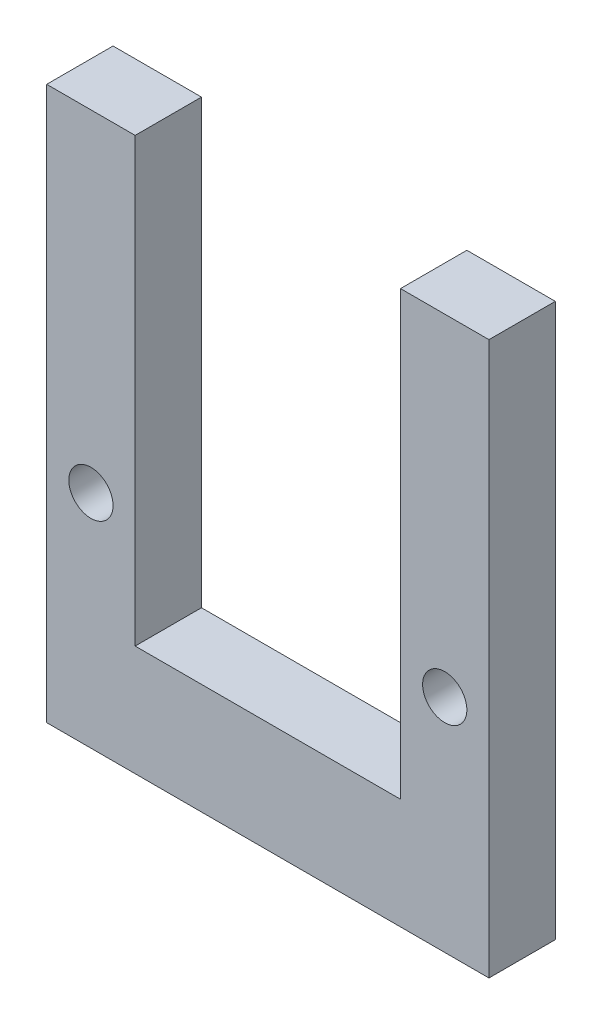
ISO-10303-21;
HEADER;
FILE_DESCRIPTION(('STEP AP214'),'2;1');
FILE_NAME('part.step','',(''),(''),'','','');
FILE_SCHEMA(('AUTOMOTIVE_DESIGN { 1 0 10303 214 1 1 1 1 }'));
ENDSEC;
DATA;
#1=APPLICATION_CONTEXT('core data for automotive mechanical design processes');
#2=APPLICATION_PROTOCOL_DEFINITION('international standard','automotive_design',2000,#1);
#3=PRODUCT_CONTEXT('',#1,'mechanical');
#4=PRODUCT('Part','Part','',(#3));
#5=PRODUCT_RELATED_PRODUCT_CATEGORY('part','',(#4));
#6=PRODUCT_DEFINITION_FORMATION('','',#4);
#7=PRODUCT_DEFINITION_CONTEXT('part definition',#1,'design');
#8=PRODUCT_DEFINITION('design','',#6,#7);
#9=PRODUCT_DEFINITION_SHAPE('','',#8);
#10=(LENGTH_UNIT() NAMED_UNIT(*) SI_UNIT(.MILLI.,.METRE.));
#11=(NAMED_UNIT(*) PLANE_ANGLE_UNIT() SI_UNIT($,.RADIAN.));
#12=(NAMED_UNIT(*) SI_UNIT($,.STERADIAN.) SOLID_ANGLE_UNIT());
#13=UNCERTAINTY_MEASURE_WITH_UNIT(LENGTH_MEASURE(1.E-05),#10,'distance_accuracy_value','');
#14=(GEOMETRIC_REPRESENTATION_CONTEXT(3) GLOBAL_UNCERTAINTY_ASSIGNED_CONTEXT((#13)) GLOBAL_UNIT_ASSIGNED_CONTEXT((#10,
#11,#12)) REPRESENTATION_CONTEXT('',''));
#15=CARTESIAN_POINT('',(0.,0.,0.));
#16=DIRECTION('',(0.,0.,1.));
#17=DIRECTION('',(1.,0.,0.));
#18=AXIS2_PLACEMENT_3D('',#15,#16,#17);
#19=CARTESIAN_POINT('',(0.,0.,1.5));
#20=DIRECTION('',(0.,0.,1.));
#21=DIRECTION('',(1.,0.,0.));
#22=AXIS2_PLACEMENT_3D('',#19,#20,#21);
#23=PLANE('',#22);
#24=CARTESIAN_POINT('',(-8.,-2.5,1.5));
#25=DIRECTION('',(0.,0.,1.));
#26=DIRECTION('',(1.,0.,0.));
#27=AXIS2_PLACEMENT_3D('',#24,#25,#26);
#28=CIRCLE('',#27,1.);
#29=CARTESIAN_POINT('',(-7.,-2.5,1.5));
#30=VERTEX_POINT('',#29);
#31=EDGE_CURVE('E134',#30,#30,#28,.T.);
#32=ORIENTED_EDGE('',*,*,#31,.F.);
#33=EDGE_LOOP('',(#32));
#34=FACE_BOUND('',#33,.T.);
#35=DIRECTION('',(0.,1.,0.));
#36=VECTOR('',#35,1.);
#37=CARTESIAN_POINT('',(10.,12.5,1.5));
#38=LINE('',#37,#36);
#39=CARTESIAN_POINT('',(10.,-12.5,1.5));
#40=VERTEX_POINT('',#39);
#41=CARTESIAN_POINT('',(10.,12.5,1.5));
#42=VERTEX_POINT('',#41);
#43=EDGE_CURVE('E145',#40,#42,#38,.T.);
#44=ORIENTED_EDGE('',*,*,#43,.T.);
#45=DIRECTION('',(-1.,0.,0.));
#46=VECTOR('',#45,1.);
#47=CARTESIAN_POINT('',(6.,12.5,1.5));
#48=LINE('',#47,#46);
#49=CARTESIAN_POINT('',(6.,12.5,1.5));
#50=VERTEX_POINT('',#49);
#51=EDGE_CURVE('E93',#42,#50,#48,.T.);
#52=ORIENTED_EDGE('',*,*,#51,.T.);
#53=DIRECTION('',(0.,-1.,0.));
#54=VECTOR('',#53,1.);
#55=CARTESIAN_POINT('',(6.,-7.5,1.5));
#56=LINE('',#55,#54);
#57=CARTESIAN_POINT('',(6.,-7.5,1.5));
#58=VERTEX_POINT('',#57);
#59=EDGE_CURVE('E160',#50,#58,#56,.T.);
#60=ORIENTED_EDGE('',*,*,#59,.T.);
#61=DIRECTION('',(-1.,0.,0.));
#62=VECTOR('',#61,1.);
#63=CARTESIAN_POINT('',(-6.,-7.5,1.5));
#64=LINE('',#63,#62);
#65=CARTESIAN_POINT('',(-6.,-7.5,1.5));
#66=VERTEX_POINT('',#65);
#67=EDGE_CURVE('E173',#58,#66,#64,.T.);
#68=ORIENTED_EDGE('',*,*,#67,.T.);
#69=DIRECTION('',(0.,1.,0.));
#70=VECTOR('',#69,1.);
#71=CARTESIAN_POINT('',(-6.,-7.5,1.5));
#72=LINE('',#71,#70);
#73=CARTESIAN_POINT('',(-6.,12.5,1.5));
#74=VERTEX_POINT('',#73);
#75=EDGE_CURVE('E112',#66,#74,#72,.T.);
#76=ORIENTED_EDGE('',*,*,#75,.T.);
#77=DIRECTION('',(-1.,0.,0.));
#78=VECTOR('',#77,1.);
#79=CARTESIAN_POINT('',(-10.,12.5,1.5));
#80=LINE('',#79,#78);
#81=CARTESIAN_POINT('',(-10.,12.5,1.5));
#82=VERTEX_POINT('',#81);
#83=EDGE_CURVE('E106',#74,#82,#80,.T.);
#84=ORIENTED_EDGE('',*,*,#83,.T.);
#85=DIRECTION('',(0.,-1.,0.));
#86=VECTOR('',#85,1.);
#87=CARTESIAN_POINT('',(-10.,12.5,1.5));
#88=LINE('',#87,#86);
#89=CARTESIAN_POINT('',(-10.,-12.5,1.5));
#90=VERTEX_POINT('',#89);
#91=EDGE_CURVE('E110',#82,#90,#88,.T.);
#92=ORIENTED_EDGE('',*,*,#91,.T.);
#93=DIRECTION('',(1.,0.,0.));
#94=VECTOR('',#93,1.);
#95=CARTESIAN_POINT('',(-10.,-12.5,1.5));
#96=LINE('',#95,#94);
#97=EDGE_CURVE('E50',#90,#40,#96,.T.);
#98=ORIENTED_EDGE('',*,*,#97,.T.);
#99=EDGE_LOOP('',(#44,#52,#60,#68,#76,#84,#92,#98));
#100=FACE_BOUND('',#99,.T.);
#101=CARTESIAN_POINT('',(8.00000000000001,-2.49999999999999,1.5));
#102=DIRECTION('',(0.,0.,1.));
#103=DIRECTION('',(-1.,0.,0.));
#104=AXIS2_PLACEMENT_3D('',#101,#102,#103);
#105=CIRCLE('',#104,1.);
#106=CARTESIAN_POINT('',(7.00000000000001,-2.49999999999999,1.5));
#107=VERTEX_POINT('',#106);
#108=EDGE_CURVE('E182',#107,#107,#105,.T.);
#109=ORIENTED_EDGE('',*,*,#108,.F.);
#110=EDGE_LOOP('',(#109));
#111=FACE_BOUND('',#110,.T.);
#112=ADVANCED_FACE('F33',(#34,#100,#111),#23,.T.);
#113=CARTESIAN_POINT('',(0.,0.,-1.5));
#114=DIRECTION('',(0.,0.,1.));
#115=DIRECTION('',(1.,0.,0.));
#116=AXIS2_PLACEMENT_3D('',#113,#114,#115);
#117=PLANE('',#116);
#118=DIRECTION('',(0.,1.,0.));
#119=VECTOR('',#118,1.);
#120=CARTESIAN_POINT('',(10.,12.5,-1.5));
#121=LINE('',#120,#119);
#122=CARTESIAN_POINT('',(10.,-12.5,-1.5));
#123=VERTEX_POINT('',#122);
#124=CARTESIAN_POINT('',(10.,12.5,-1.5));
#125=VERTEX_POINT('',#124);
#126=EDGE_CURVE('E130',#123,#125,#121,.T.);
#127=ORIENTED_EDGE('',*,*,#126,.F.);
#128=DIRECTION('',(1.,0.,0.));
#129=VECTOR('',#128,1.);
#130=CARTESIAN_POINT('',(-10.,-12.5,-1.5));
#131=LINE('',#130,#129);
#132=CARTESIAN_POINT('',(-10.,-12.5,-1.5));
#133=VERTEX_POINT('',#132);
#134=EDGE_CURVE('E85',#133,#123,#131,.T.);
#135=ORIENTED_EDGE('',*,*,#134,.F.);
#136=DIRECTION('',(0.,-1.,0.));
#137=VECTOR('',#136,1.);
#138=CARTESIAN_POINT('',(-10.,12.5,-1.5));
#139=LINE('',#138,#137);
#140=CARTESIAN_POINT('',(-10.,12.5,-1.5));
#141=VERTEX_POINT('',#140);
#142=EDGE_CURVE('E79',#141,#133,#139,.T.);
#143=ORIENTED_EDGE('',*,*,#142,.F.);
#144=DIRECTION('',(-1.,0.,0.));
#145=VECTOR('',#144,1.);
#146=CARTESIAN_POINT('',(-10.,12.5,-1.5));
#147=LINE('',#146,#145);
#148=CARTESIAN_POINT('',(-6.,12.5,-1.5));
#149=VERTEX_POINT('',#148);
#150=EDGE_CURVE('E120',#149,#141,#147,.T.);
#151=ORIENTED_EDGE('',*,*,#150,.F.);
#152=DIRECTION('',(0.,1.,0.));
#153=VECTOR('',#152,1.);
#154=CARTESIAN_POINT('',(-6.,-7.5,-1.5));
#155=LINE('',#154,#153);
#156=CARTESIAN_POINT('',(-6.,-7.5,-1.5));
#157=VERTEX_POINT('',#156);
#158=EDGE_CURVE('E140',#157,#149,#155,.T.);
#159=ORIENTED_EDGE('',*,*,#158,.F.);
#160=DIRECTION('',(-1.,0.,0.));
#161=VECTOR('',#160,1.);
#162=CARTESIAN_POINT('',(-6.,-7.5,-1.5));
#163=LINE('',#162,#161);
#164=CARTESIAN_POINT('',(6.,-7.5,-1.5));
#165=VERTEX_POINT('',#164);
#166=EDGE_CURVE('E138',#165,#157,#163,.T.);
#167=ORIENTED_EDGE('',*,*,#166,.F.);
#168=DIRECTION('',(0.,-1.,0.));
#169=VECTOR('',#168,1.);
#170=CARTESIAN_POINT('',(6.,-7.5,-1.5));
#171=LINE('',#170,#169);
#172=CARTESIAN_POINT('',(6.,12.5,-1.5));
#173=VERTEX_POINT('',#172);
#174=EDGE_CURVE('E136',#173,#165,#171,.T.);
#175=ORIENTED_EDGE('',*,*,#174,.F.);
#176=DIRECTION('',(-1.,0.,0.));
#177=VECTOR('',#176,1.);
#178=CARTESIAN_POINT('',(6.,12.5,-1.5));
#179=LINE('',#178,#177);
#180=EDGE_CURVE('E133',#125,#173,#179,.T.);
#181=ORIENTED_EDGE('',*,*,#180,.F.);
#182=EDGE_LOOP('',(#127,#135,#143,#151,#159,#167,#175,#181));
#183=FACE_BOUND('',#182,.T.);
#184=CARTESIAN_POINT('',(-8.,-2.5,-1.5));
#185=DIRECTION('',(0.,0.,1.));
#186=DIRECTION('',(1.,0.,0.));
#187=AXIS2_PLACEMENT_3D('',#184,#185,#186);
#188=CIRCLE('',#187,1.);
#189=CARTESIAN_POINT('',(-7.,-2.5,-1.5));
#190=VERTEX_POINT('',#189);
#191=EDGE_CURVE('E179',#190,#190,#188,.T.);
#192=ORIENTED_EDGE('',*,*,#191,.T.);
#193=EDGE_LOOP('',(#192));
#194=FACE_BOUND('',#193,.T.);
#195=CARTESIAN_POINT('',(8.00000000000001,-2.49999999999999,-1.5));
#196=DIRECTION('',(0.,0.,1.));
#197=DIRECTION('',(-1.,0.,0.));
#198=AXIS2_PLACEMENT_3D('',#195,#196,#197);
#199=CIRCLE('',#198,1.);
#200=CARTESIAN_POINT('',(7.00000000000001,-2.49999999999999,-1.5));
#201=VERTEX_POINT('',#200);
#202=EDGE_CURVE('E185',#201,#201,#199,.T.);
#203=ORIENTED_EDGE('',*,*,#202,.T.);
#204=EDGE_LOOP('',(#203));
#205=FACE_BOUND('',#204,.T.);
#206=ADVANCED_FACE('F164',(#183,#194,#205),#117,.F.);
#207=CARTESIAN_POINT('',(10.,12.5,1.5));
#208=DIRECTION('',(-1.,0.,0.));
#209=DIRECTION('',(0.,-1.,0.));
#210=AXIS2_PLACEMENT_3D('',#207,#208,#209);
#211=PLANE('',#210);
#212=ORIENTED_EDGE('',*,*,#126,.T.);
#213=DIRECTION('',(0.,0.,-1.));
#214=VECTOR('',#213,1.);
#215=CARTESIAN_POINT('',(10.,12.5,1.5));
#216=LINE('',#215,#214);
#217=EDGE_CURVE('E11',#42,#125,#216,.T.);
#218=ORIENTED_EDGE('',*,*,#217,.F.);
#219=ORIENTED_EDGE('',*,*,#43,.F.);
#220=DIRECTION('',(0.,0.,-1.));
#221=VECTOR('',#220,1.);
#222=CARTESIAN_POINT('',(10.,-12.5,1.5));
#223=LINE('',#222,#221);
#224=EDGE_CURVE('E126',#40,#123,#223,.T.);
#225=ORIENTED_EDGE('',*,*,#224,.T.);
#226=EDGE_LOOP('',(#212,#218,#219,#225));
#227=FACE_BOUND('',#226,.T.);
#228=ADVANCED_FACE('F35',(#227),#211,.F.);
#229=CARTESIAN_POINT('',(6.,12.5,1.5));
#230=DIRECTION('',(0.,-1.,0.));
#231=DIRECTION('',(0.,0.,-1.));
#232=AXIS2_PLACEMENT_3D('',#229,#230,#231);
#233=PLANE('',#232);
#234=ORIENTED_EDGE('',*,*,#180,.T.);
#235=DIRECTION('',(0.,0.,-1.));
#236=VECTOR('',#235,1.);
#237=CARTESIAN_POINT('',(6.,12.5,1.5));
#238=LINE('',#237,#236);
#239=EDGE_CURVE('E42',#50,#173,#238,.T.);
#240=ORIENTED_EDGE('',*,*,#239,.F.);
#241=ORIENTED_EDGE('',*,*,#51,.F.);
#242=ORIENTED_EDGE('',*,*,#217,.T.);
#243=EDGE_LOOP('',(#234,#240,#241,#242));
#244=FACE_BOUND('',#243,.T.);
#245=ADVANCED_FACE('F217',(#244),#233,.F.);
#246=CARTESIAN_POINT('',(6.,-7.5,1.5));
#247=DIRECTION('',(1.,0.,0.));
#248=DIRECTION('',(0.,0.,-1.));
#249=AXIS2_PLACEMENT_3D('',#246,#247,#248);
#250=PLANE('',#249);
#251=ORIENTED_EDGE('',*,*,#174,.T.);
#252=DIRECTION('',(0.,0.,-1.));
#253=VECTOR('',#252,1.);
#254=CARTESIAN_POINT('',(6.,-7.5,1.5));
#255=LINE('',#254,#253);
#256=EDGE_CURVE('E152',#58,#165,#255,.T.);
#257=ORIENTED_EDGE('',*,*,#256,.F.);
#258=ORIENTED_EDGE('',*,*,#59,.F.);
#259=ORIENTED_EDGE('',*,*,#239,.T.);
#260=EDGE_LOOP('',(#251,#257,#258,#259));
#261=FACE_BOUND('',#260,.T.);
#262=ADVANCED_FACE('F158',(#261),#250,.F.);
#263=CARTESIAN_POINT('',(-6.,-7.5,1.5));
#264=DIRECTION('',(0.,-1.,0.));
#265=DIRECTION('',(0.,0.,-1.));
#266=AXIS2_PLACEMENT_3D('',#263,#264,#265);
#267=PLANE('',#266);
#268=ORIENTED_EDGE('',*,*,#166,.T.);
#269=DIRECTION('',(0.,0.,-1.));
#270=VECTOR('',#269,1.);
#271=CARTESIAN_POINT('',(-6.,-7.5,1.5));
#272=LINE('',#271,#270);
#273=EDGE_CURVE('E149',#66,#157,#272,.T.);
#274=ORIENTED_EDGE('',*,*,#273,.F.);
#275=ORIENTED_EDGE('',*,*,#67,.F.);
#276=ORIENTED_EDGE('',*,*,#256,.T.);
#277=EDGE_LOOP('',(#268,#274,#275,#276));
#278=FACE_BOUND('',#277,.T.);
#279=ADVANCED_FACE('F169',(#278),#267,.F.);
#280=CARTESIAN_POINT('',(-6.,-7.5,1.5));
#281=DIRECTION('',(-1.,0.,0.));
#282=DIRECTION('',(0.,0.,1.));
#283=AXIS2_PLACEMENT_3D('',#280,#281,#282);
#284=PLANE('',#283);
#285=ORIENTED_EDGE('',*,*,#158,.T.);
#286=DIRECTION('',(0.,0.,-1.));
#287=VECTOR('',#286,1.);
#288=CARTESIAN_POINT('',(-6.,12.5,1.5));
#289=LINE('',#288,#287);
#290=EDGE_CURVE('E121',#74,#149,#289,.T.);
#291=ORIENTED_EDGE('',*,*,#290,.F.);
#292=ORIENTED_EDGE('',*,*,#75,.F.);
#293=ORIENTED_EDGE('',*,*,#273,.T.);
#294=EDGE_LOOP('',(#285,#291,#292,#293));
#295=FACE_BOUND('',#294,.T.);
#296=ADVANCED_FACE('F172',(#295),#284,.F.);
#297=CARTESIAN_POINT('',(-10.,12.5,1.5));
#298=DIRECTION('',(0.,-1.,0.));
#299=DIRECTION('',(1.,0.,0.));
#300=AXIS2_PLACEMENT_3D('',#297,#298,#299);
#301=PLANE('',#300);
#302=ORIENTED_EDGE('',*,*,#150,.T.);
#303=DIRECTION('',(0.,0.,-1.));
#304=VECTOR('',#303,1.);
#305=CARTESIAN_POINT('',(-10.,12.5,1.5));
#306=LINE('',#305,#304);
#307=EDGE_CURVE('E117',#82,#141,#306,.T.);
#308=ORIENTED_EDGE('',*,*,#307,.F.);
#309=ORIENTED_EDGE('',*,*,#83,.F.);
#310=ORIENTED_EDGE('',*,*,#290,.T.);
#311=EDGE_LOOP('',(#302,#308,#309,#310));
#312=FACE_BOUND('',#311,.T.);
#313=ADVANCED_FACE('F118',(#312),#301,.F.);
#314=CARTESIAN_POINT('',(-10.,12.5,1.5));
#315=DIRECTION('',(1.,0.,0.));
#316=DIRECTION('',(0.,1.,0.));
#317=AXIS2_PLACEMENT_3D('',#314,#315,#316);
#318=PLANE('',#317);
#319=ORIENTED_EDGE('',*,*,#142,.T.);
#320=DIRECTION('',(0.,0.,-1.));
#321=VECTOR('',#320,1.);
#322=CARTESIAN_POINT('',(-10.,-12.5,1.5));
#323=LINE('',#322,#321);
#324=EDGE_CURVE('E122',#90,#133,#323,.T.);
#325=ORIENTED_EDGE('',*,*,#324,.F.);
#326=ORIENTED_EDGE('',*,*,#91,.F.);
#327=ORIENTED_EDGE('',*,*,#307,.T.);
#328=EDGE_LOOP('',(#319,#325,#326,#327));
#329=FACE_BOUND('',#328,.T.);
#330=ADVANCED_FACE('F124',(#329),#318,.F.);
#331=CARTESIAN_POINT('',(-10.,-12.5,1.5));
#332=DIRECTION('',(0.,1.,0.));
#333=DIRECTION('',(0.,0.,1.));
#334=AXIS2_PLACEMENT_3D('',#331,#332,#333);
#335=PLANE('',#334);
#336=ORIENTED_EDGE('',*,*,#134,.T.);
#337=ORIENTED_EDGE('',*,*,#224,.F.);
#338=ORIENTED_EDGE('',*,*,#97,.F.);
#339=ORIENTED_EDGE('',*,*,#324,.T.);
#340=EDGE_LOOP('',(#336,#337,#338,#339));
#341=FACE_BOUND('',#340,.T.);
#342=ADVANCED_FACE('F205',(#341),#335,.F.);
#343=CARTESIAN_POINT('',(-8.,-2.5,1.5));
#344=DIRECTION('',(0.,0.,-1.));
#345=DIRECTION('',(-1.,0.,0.));
#346=AXIS2_PLACEMENT_3D('',#343,#344,#345);
#347=CYLINDRICAL_SURFACE('',#346,1.);
#348=ORIENTED_EDGE('',*,*,#31,.T.);
#349=EDGE_LOOP('',(#348));
#350=FACE_BOUND('',#349,.T.);
#351=ORIENTED_EDGE('',*,*,#191,.F.);
#352=EDGE_LOOP('',(#351));
#353=FACE_BOUND('',#352,.T.);
#354=ADVANCED_FACE('F202',(#350,#353),#347,.F.);
#355=CARTESIAN_POINT('',(8.00000000000001,-2.49999999999999,1.5));
#356=DIRECTION('',(0.,0.,-1.));
#357=DIRECTION('',(-1.,0.,0.));
#358=AXIS2_PLACEMENT_3D('',#355,#356,#357);
#359=CYLINDRICAL_SURFACE('',#358,1.);
#360=ORIENTED_EDGE('',*,*,#108,.T.);
#361=EDGE_LOOP('',(#360));
#362=FACE_BOUND('',#361,.T.);
#363=ORIENTED_EDGE('',*,*,#202,.F.);
#364=EDGE_LOOP('',(#363));
#365=FACE_BOUND('',#364,.T.);
#366=ADVANCED_FACE('F191',(#362,#365),#359,.F.);
#367=CLOSED_SHELL('',(#112,#206,#228,#245,#262,#279,#296,#313,#330,#342,#354,#366));
#368=MANIFOLD_SOLID_BREP('B2',#367);
#369=ADVANCED_BREP_SHAPE_REPRESENTATION('',(#18,#368),#14);
#370=SHAPE_DEFINITION_REPRESENTATION(#9,#369);
ENDSEC;
END-ISO-10303-21;
